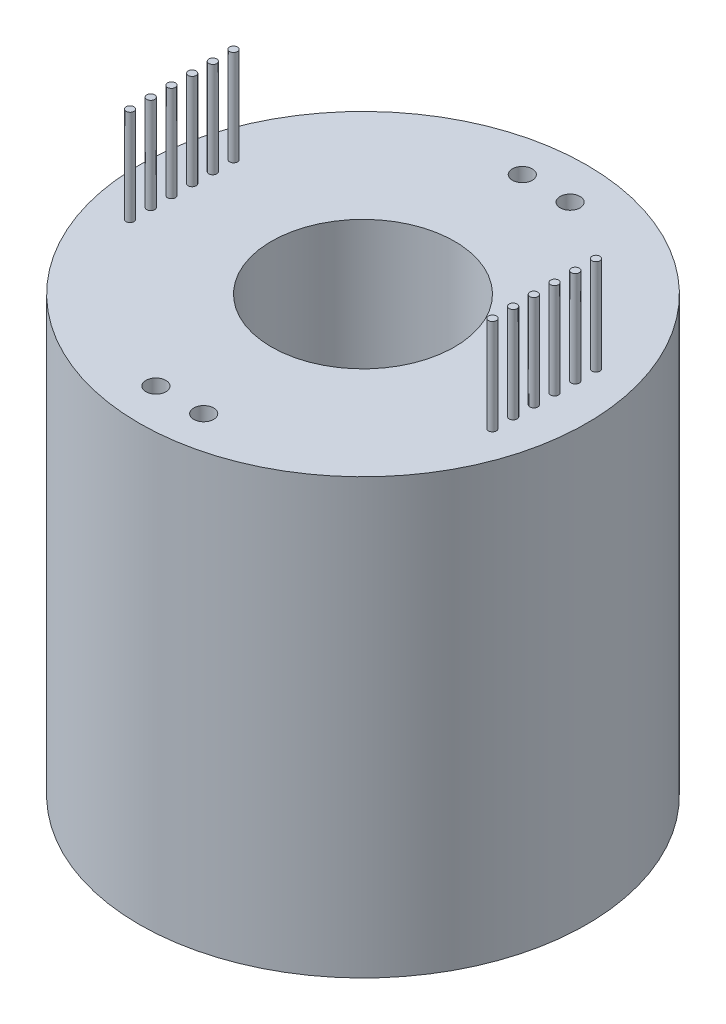
ISO-10303-21;
HEADER;
FILE_DESCRIPTION(('STEP AP214'),'2;1');
FILE_NAME('part.step','',(''),(''),'','','');
FILE_SCHEMA(('AUTOMOTIVE_DESIGN { 1 0 10303 214 1 1 1 1 }'));
ENDSEC;
DATA;
#1=APPLICATION_CONTEXT('core data for automotive mechanical design processes');
#2=APPLICATION_PROTOCOL_DEFINITION('international standard','automotive_design',2000,#1);
#3=PRODUCT_CONTEXT('',#1,'mechanical');
#4=PRODUCT('Part','Part','',(#3));
#5=PRODUCT_RELATED_PRODUCT_CATEGORY('part','',(#4));
#6=PRODUCT_DEFINITION_FORMATION('','',#4);
#7=PRODUCT_DEFINITION_CONTEXT('part definition',#1,'design');
#8=PRODUCT_DEFINITION('design','',#6,#7);
#9=PRODUCT_DEFINITION_SHAPE('','',#8);
#10=(LENGTH_UNIT() NAMED_UNIT(*) SI_UNIT(.MILLI.,.METRE.));
#11=(NAMED_UNIT(*) PLANE_ANGLE_UNIT() SI_UNIT($,.RADIAN.));
#12=(NAMED_UNIT(*) SI_UNIT($,.STERADIAN.) SOLID_ANGLE_UNIT());
#13=UNCERTAINTY_MEASURE_WITH_UNIT(LENGTH_MEASURE(1.E-05),#10,'distance_accuracy_value','');
#14=(GEOMETRIC_REPRESENTATION_CONTEXT(3) GLOBAL_UNCERTAINTY_ASSIGNED_CONTEXT((#13)) GLOBAL_UNIT_ASSIGNED_CONTEXT((#10,
#11,#12)) REPRESENTATION_CONTEXT('',''));
#15=CARTESIAN_POINT('',(0.,0.,0.));
#16=DIRECTION('',(0.,0.,1.));
#17=DIRECTION('',(1.,0.,0.));
#18=AXIS2_PLACEMENT_3D('',#15,#16,#17);
#19=CARTESIAN_POINT('',(22.75,66.5,-6.50000000000001));
#20=DIRECTION('',(0.,-1.,0.));
#21=DIRECTION('',(0.,0.,-1.));
#22=AXIS2_PLACEMENT_3D('',#19,#20,#21);
#23=CYLINDRICAL_SURFACE('',#22,0.499999999999999);
#24=CARTESIAN_POINT('',(22.75,66.5,-6.50000000000001));
#25=DIRECTION('',(0.,1.,0.));
#26=DIRECTION('',(0.,0.,-1.));
#27=AXIS2_PLACEMENT_3D('',#24,#25,#26);
#28=CIRCLE('',#27,0.499999999999999);
#29=CARTESIAN_POINT('',(22.75,66.5,-7.));
#30=VERTEX_POINT('',#29);
#31=EDGE_CURVE('E11',#30,#30,#28,.T.);
#32=ORIENTED_EDGE('',*,*,#31,.F.);
#33=EDGE_LOOP('',(#32));
#34=FACE_BOUND('',#33,.T.);
#35=CARTESIAN_POINT('',(22.75,54.5,-6.50000000000001));
#36=DIRECTION('',(0.,1.,0.));
#37=DIRECTION('',(0.,0.,-1.));
#38=AXIS2_PLACEMENT_3D('',#35,#36,#37);
#39=CIRCLE('',#38,0.499999999999999);
#40=CARTESIAN_POINT('',(22.75,54.5,-7.));
#41=VERTEX_POINT('',#40);
#42=EDGE_CURVE('E53',#41,#41,#39,.T.);
#43=ORIENTED_EDGE('',*,*,#42,.T.);
#44=EDGE_LOOP('',(#43));
#45=FACE_BOUND('',#44,.T.);
#46=ADVANCED_FACE('F50',(#34,#45),#23,.T.);
#47=CARTESIAN_POINT('',(22.75,66.5,-6.50000000000001));
#48=DIRECTION('',(0.,-1.,0.));
#49=DIRECTION('',(0.,0.,-1.));
#50=AXIS2_PLACEMENT_3D('',#47,#48,#49);
#51=PLANE('',#50);
#52=ORIENTED_EDGE('',*,*,#31,.T.);
#53=EDGE_LOOP('',(#52));
#54=FACE_BOUND('',#53,.T.);
#55=ADVANCED_FACE('F65',(#54),#51,.F.);
#56=CARTESIAN_POINT('',(22.75,54.5,-6.50000000000001));
#57=DIRECTION('',(0.,-1.,0.));
#58=DIRECTION('',(0.,0.,-1.));
#59=AXIS2_PLACEMENT_3D('',#56,#57,#58);
#60=PLANE('',#59);
#61=ORIENTED_EDGE('',*,*,#42,.F.);
#62=EDGE_LOOP('',(#61));
#63=FACE_BOUND('',#62,.T.);
#64=ADVANCED_FACE('F63',(#63),#60,.T.);
#65=CLOSED_SHELL('',(#46,#55,#64));
#66=MANIFOLD_SOLID_BREP('B2',#65);
#67=CARTESIAN_POINT('',(22.75,66.5,-3.9));
#68=DIRECTION('',(0.,-1.,0.));
#69=DIRECTION('',(0.,0.,-1.));
#70=AXIS2_PLACEMENT_3D('',#67,#68,#69);
#71=CYLINDRICAL_SURFACE('',#70,0.499999999999999);
#72=CARTESIAN_POINT('',(22.75,66.5,-3.9));
#73=DIRECTION('',(0.,1.,0.));
#74=DIRECTION('',(0.,0.,-1.));
#75=AXIS2_PLACEMENT_3D('',#72,#73,#74);
#76=CIRCLE('',#75,0.499999999999999);
#77=CARTESIAN_POINT('',(22.75,66.5,-4.4));
#78=VERTEX_POINT('',#77);
#79=EDGE_CURVE('E49',#78,#78,#76,.T.);
#80=ORIENTED_EDGE('',*,*,#79,.F.);
#81=EDGE_LOOP('',(#80));
#82=FACE_BOUND('',#81,.T.);
#83=CARTESIAN_POINT('',(22.75,54.5,-3.9));
#84=DIRECTION('',(0.,1.,0.));
#85=DIRECTION('',(0.,0.,-1.));
#86=AXIS2_PLACEMENT_3D('',#83,#84,#85);
#87=CIRCLE('',#86,0.499999999999999);
#88=CARTESIAN_POINT('',(22.75,54.5,-4.4));
#89=VERTEX_POINT('',#88);
#90=EDGE_CURVE('E102',#89,#89,#87,.T.);
#91=ORIENTED_EDGE('',*,*,#90,.T.);
#92=EDGE_LOOP('',(#91));
#93=FACE_BOUND('',#92,.T.);
#94=ADVANCED_FACE('F99',(#82,#93),#71,.T.);
#95=CARTESIAN_POINT('',(22.75,66.5,-3.9));
#96=DIRECTION('',(0.,-1.,0.));
#97=DIRECTION('',(0.,0.,-1.));
#98=AXIS2_PLACEMENT_3D('',#95,#96,#97);
#99=PLANE('',#98);
#100=ORIENTED_EDGE('',*,*,#79,.T.);
#101=EDGE_LOOP('',(#100));
#102=FACE_BOUND('',#101,.T.);
#103=ADVANCED_FACE('F114',(#102),#99,.F.);
#104=CARTESIAN_POINT('',(22.75,54.5,-3.9));
#105=DIRECTION('',(0.,-1.,0.));
#106=DIRECTION('',(0.,0.,-1.));
#107=AXIS2_PLACEMENT_3D('',#104,#105,#106);
#108=PLANE('',#107);
#109=ORIENTED_EDGE('',*,*,#90,.F.);
#110=EDGE_LOOP('',(#109));
#111=FACE_BOUND('',#110,.T.);
#112=ADVANCED_FACE('F112',(#111),#108,.T.);
#113=CLOSED_SHELL('',(#94,#103,#112));
#114=MANIFOLD_SOLID_BREP('B6',#113);
#115=CARTESIAN_POINT('',(22.75,66.5,-1.30000000000001));
#116=DIRECTION('',(0.,-1.,0.));
#117=DIRECTION('',(0.,0.,-1.));
#118=AXIS2_PLACEMENT_3D('',#115,#116,#117);
#119=CYLINDRICAL_SURFACE('',#118,0.499999999999999);
#120=CARTESIAN_POINT('',(22.75,66.5,-1.30000000000001));
#121=DIRECTION('',(0.,1.,0.));
#122=DIRECTION('',(0.,0.,-1.));
#123=AXIS2_PLACEMENT_3D('',#120,#121,#122);
#124=CIRCLE('',#123,0.499999999999999);
#125=CARTESIAN_POINT('',(22.75,66.5,-1.80000000000001));
#126=VERTEX_POINT('',#125);
#127=EDGE_CURVE('E98',#126,#126,#124,.T.);
#128=ORIENTED_EDGE('',*,*,#127,.F.);
#129=EDGE_LOOP('',(#128));
#130=FACE_BOUND('',#129,.T.);
#131=CARTESIAN_POINT('',(22.75,54.5,-1.30000000000001));
#132=DIRECTION('',(0.,1.,0.));
#133=DIRECTION('',(0.,0.,-1.));
#134=AXIS2_PLACEMENT_3D('',#131,#132,#133);
#135=CIRCLE('',#134,0.499999999999999);
#136=CARTESIAN_POINT('',(22.75,54.5,-1.80000000000001));
#137=VERTEX_POINT('',#136);
#138=EDGE_CURVE('E151',#137,#137,#135,.T.);
#139=ORIENTED_EDGE('',*,*,#138,.T.);
#140=EDGE_LOOP('',(#139));
#141=FACE_BOUND('',#140,.T.);
#142=ADVANCED_FACE('F148',(#130,#141),#119,.T.);
#143=CARTESIAN_POINT('',(22.75,66.5,-1.30000000000001));
#144=DIRECTION('',(0.,-1.,0.));
#145=DIRECTION('',(0.,0.,-1.));
#146=AXIS2_PLACEMENT_3D('',#143,#144,#145);
#147=PLANE('',#146);
#148=ORIENTED_EDGE('',*,*,#127,.T.);
#149=EDGE_LOOP('',(#148));
#150=FACE_BOUND('',#149,.T.);
#151=ADVANCED_FACE('F163',(#150),#147,.F.);
#152=CARTESIAN_POINT('',(22.75,54.5,-1.30000000000001));
#153=DIRECTION('',(0.,-1.,0.));
#154=DIRECTION('',(0.,0.,-1.));
#155=AXIS2_PLACEMENT_3D('',#152,#153,#154);
#156=PLANE('',#155);
#157=ORIENTED_EDGE('',*,*,#138,.F.);
#158=EDGE_LOOP('',(#157));
#159=FACE_BOUND('',#158,.T.);
#160=ADVANCED_FACE('F161',(#159),#156,.T.);
#161=CLOSED_SHELL('',(#142,#151,#160));
#162=MANIFOLD_SOLID_BREP('B44',#161);
#163=CARTESIAN_POINT('',(22.75,66.5,1.29999999999999));
#164=DIRECTION('',(0.,-1.,0.));
#165=DIRECTION('',(0.,0.,-1.));
#166=AXIS2_PLACEMENT_3D('',#163,#164,#165);
#167=CYLINDRICAL_SURFACE('',#166,0.499999999999999);
#168=CARTESIAN_POINT('',(22.75,66.5,1.29999999999999));
#169=DIRECTION('',(0.,1.,0.));
#170=DIRECTION('',(0.,0.,-1.));
#171=AXIS2_PLACEMENT_3D('',#168,#169,#170);
#172=CIRCLE('',#171,0.499999999999999);
#173=CARTESIAN_POINT('',(22.75,66.5,0.799999999999995));
#174=VERTEX_POINT('',#173);
#175=EDGE_CURVE('E147',#174,#174,#172,.T.);
#176=ORIENTED_EDGE('',*,*,#175,.F.);
#177=EDGE_LOOP('',(#176));
#178=FACE_BOUND('',#177,.T.);
#179=CARTESIAN_POINT('',(22.75,54.5,1.29999999999999));
#180=DIRECTION('',(0.,1.,0.));
#181=DIRECTION('',(0.,0.,-1.));
#182=AXIS2_PLACEMENT_3D('',#179,#180,#181);
#183=CIRCLE('',#182,0.499999999999999);
#184=CARTESIAN_POINT('',(22.75,54.5,0.799999999999995));
#185=VERTEX_POINT('',#184);
#186=EDGE_CURVE('E200',#185,#185,#183,.T.);
#187=ORIENTED_EDGE('',*,*,#186,.T.);
#188=EDGE_LOOP('',(#187));
#189=FACE_BOUND('',#188,.T.);
#190=ADVANCED_FACE('F197',(#178,#189),#167,.T.);
#191=CARTESIAN_POINT('',(22.75,66.5,1.29999999999999));
#192=DIRECTION('',(0.,-1.,0.));
#193=DIRECTION('',(0.,0.,-1.));
#194=AXIS2_PLACEMENT_3D('',#191,#192,#193);
#195=PLANE('',#194);
#196=ORIENTED_EDGE('',*,*,#175,.T.);
#197=EDGE_LOOP('',(#196));
#198=FACE_BOUND('',#197,.T.);
#199=ADVANCED_FACE('F212',(#198),#195,.F.);
#200=CARTESIAN_POINT('',(22.75,54.5,1.29999999999999));
#201=DIRECTION('',(0.,-1.,0.));
#202=DIRECTION('',(0.,0.,-1.));
#203=AXIS2_PLACEMENT_3D('',#200,#201,#202);
#204=PLANE('',#203);
#205=ORIENTED_EDGE('',*,*,#186,.F.);
#206=EDGE_LOOP('',(#205));
#207=FACE_BOUND('',#206,.T.);
#208=ADVANCED_FACE('F210',(#207),#204,.T.);
#209=CLOSED_SHELL('',(#190,#199,#208));
#210=MANIFOLD_SOLID_BREP('B93',#209);
#211=CARTESIAN_POINT('',(22.75,66.5,3.89999999999999));
#212=DIRECTION('',(0.,-1.,0.));
#213=DIRECTION('',(0.,0.,-1.));
#214=AXIS2_PLACEMENT_3D('',#211,#212,#213);
#215=CYLINDRICAL_SURFACE('',#214,0.499999999999999);
#216=CARTESIAN_POINT('',(22.75,66.5,3.89999999999999));
#217=DIRECTION('',(0.,1.,0.));
#218=DIRECTION('',(0.,0.,-1.));
#219=AXIS2_PLACEMENT_3D('',#216,#217,#218);
#220=CIRCLE('',#219,0.499999999999999);
#221=CARTESIAN_POINT('',(22.75,66.5,3.39999999999999));
#222=VERTEX_POINT('',#221);
#223=EDGE_CURVE('E196',#222,#222,#220,.T.);
#224=ORIENTED_EDGE('',*,*,#223,.F.);
#225=EDGE_LOOP('',(#224));
#226=FACE_BOUND('',#225,.T.);
#227=CARTESIAN_POINT('',(22.75,54.5,3.89999999999999));
#228=DIRECTION('',(0.,1.,0.));
#229=DIRECTION('',(0.,0.,-1.));
#230=AXIS2_PLACEMENT_3D('',#227,#228,#229);
#231=CIRCLE('',#230,0.499999999999999);
#232=CARTESIAN_POINT('',(22.75,54.5,3.39999999999999));
#233=VERTEX_POINT('',#232);
#234=EDGE_CURVE('E249',#233,#233,#231,.T.);
#235=ORIENTED_EDGE('',*,*,#234,.T.);
#236=EDGE_LOOP('',(#235));
#237=FACE_BOUND('',#236,.T.);
#238=ADVANCED_FACE('F246',(#226,#237),#215,.T.);
#239=CARTESIAN_POINT('',(22.75,66.5,3.89999999999999));
#240=DIRECTION('',(0.,-1.,0.));
#241=DIRECTION('',(0.,0.,-1.));
#242=AXIS2_PLACEMENT_3D('',#239,#240,#241);
#243=PLANE('',#242);
#244=ORIENTED_EDGE('',*,*,#223,.T.);
#245=EDGE_LOOP('',(#244));
#246=FACE_BOUND('',#245,.T.);
#247=ADVANCED_FACE('F261',(#246),#243,.F.);
#248=CARTESIAN_POINT('',(22.75,54.5,3.89999999999999));
#249=DIRECTION('',(0.,-1.,0.));
#250=DIRECTION('',(0.,0.,-1.));
#251=AXIS2_PLACEMENT_3D('',#248,#249,#250);
#252=PLANE('',#251);
#253=ORIENTED_EDGE('',*,*,#234,.F.);
#254=EDGE_LOOP('',(#253));
#255=FACE_BOUND('',#254,.T.);
#256=ADVANCED_FACE('F259',(#255),#252,.T.);
#257=CLOSED_SHELL('',(#238,#247,#256));
#258=MANIFOLD_SOLID_BREP('B142',#257);
#259=CARTESIAN_POINT('',(22.75,66.5,6.49999999999999));
#260=DIRECTION('',(0.,-1.,0.));
#261=DIRECTION('',(0.,0.,-1.));
#262=AXIS2_PLACEMENT_3D('',#259,#260,#261);
#263=CYLINDRICAL_SURFACE('',#262,0.499999999999999);
#264=CARTESIAN_POINT('',(22.75,66.5,6.49999999999999));
#265=DIRECTION('',(0.,1.,0.));
#266=DIRECTION('',(0.,0.,-1.));
#267=AXIS2_PLACEMENT_3D('',#264,#265,#266);
#268=CIRCLE('',#267,0.499999999999999);
#269=CARTESIAN_POINT('',(22.75,66.5,5.99999999999999));
#270=VERTEX_POINT('',#269);
#271=EDGE_CURVE('E245',#270,#270,#268,.T.);
#272=ORIENTED_EDGE('',*,*,#271,.F.);
#273=EDGE_LOOP('',(#272));
#274=FACE_BOUND('',#273,.T.);
#275=CARTESIAN_POINT('',(22.75,54.5,6.49999999999999));
#276=DIRECTION('',(0.,1.,0.));
#277=DIRECTION('',(0.,0.,-1.));
#278=AXIS2_PLACEMENT_3D('',#275,#276,#277);
#279=CIRCLE('',#278,0.499999999999999);
#280=CARTESIAN_POINT('',(22.75,54.5,5.99999999999999));
#281=VERTEX_POINT('',#280);
#282=EDGE_CURVE('E298',#281,#281,#279,.T.);
#283=ORIENTED_EDGE('',*,*,#282,.T.);
#284=EDGE_LOOP('',(#283));
#285=FACE_BOUND('',#284,.T.);
#286=ADVANCED_FACE('F295',(#274,#285),#263,.T.);
#287=CARTESIAN_POINT('',(22.75,66.5,6.49999999999999));
#288=DIRECTION('',(0.,-1.,0.));
#289=DIRECTION('',(0.,0.,-1.));
#290=AXIS2_PLACEMENT_3D('',#287,#288,#289);
#291=PLANE('',#290);
#292=ORIENTED_EDGE('',*,*,#271,.T.);
#293=EDGE_LOOP('',(#292));
#294=FACE_BOUND('',#293,.T.);
#295=ADVANCED_FACE('F310',(#294),#291,.F.);
#296=CARTESIAN_POINT('',(22.75,54.5,6.49999999999999));
#297=DIRECTION('',(0.,-1.,0.));
#298=DIRECTION('',(0.,0.,-1.));
#299=AXIS2_PLACEMENT_3D('',#296,#297,#298);
#300=PLANE('',#299);
#301=ORIENTED_EDGE('',*,*,#282,.F.);
#302=EDGE_LOOP('',(#301));
#303=FACE_BOUND('',#302,.T.);
#304=ADVANCED_FACE('F308',(#303),#300,.T.);
#305=CLOSED_SHELL('',(#286,#295,#304));
#306=MANIFOLD_SOLID_BREP('B191',#305);
#307=CARTESIAN_POINT('',(-22.75,66.5,6.5));
#308=DIRECTION('',(0.,-1.,0.));
#309=DIRECTION('',(0.,0.,-1.));
#310=AXIS2_PLACEMENT_3D('',#307,#308,#309);
#311=CYLINDRICAL_SURFACE('',#310,0.499999999999999);
#312=CARTESIAN_POINT('',(-22.75,66.5,6.5));
#313=DIRECTION('',(0.,1.,0.));
#314=DIRECTION('',(0.,0.,1.));
#315=AXIS2_PLACEMENT_3D('',#312,#313,#314);
#316=CIRCLE('',#315,0.499999999999999);
#317=CARTESIAN_POINT('',(-22.75,66.5,7.));
#318=VERTEX_POINT('',#317);
#319=EDGE_CURVE('E294',#318,#318,#316,.T.);
#320=ORIENTED_EDGE('',*,*,#319,.F.);
#321=EDGE_LOOP('',(#320));
#322=FACE_BOUND('',#321,.T.);
#323=CARTESIAN_POINT('',(-22.75,54.5,6.5));
#324=DIRECTION('',(0.,1.,0.));
#325=DIRECTION('',(0.,0.,1.));
#326=AXIS2_PLACEMENT_3D('',#323,#324,#325);
#327=CIRCLE('',#326,0.499999999999999);
#328=CARTESIAN_POINT('',(-22.75,54.5,7.));
#329=VERTEX_POINT('',#328);
#330=EDGE_CURVE('E347',#329,#329,#327,.T.);
#331=ORIENTED_EDGE('',*,*,#330,.T.);
#332=EDGE_LOOP('',(#331));
#333=FACE_BOUND('',#332,.T.);
#334=ADVANCED_FACE('F344',(#322,#333),#311,.T.);
#335=CARTESIAN_POINT('',(-22.75,66.5,6.5));
#336=DIRECTION('',(0.,1.,0.));
#337=DIRECTION('',(0.,0.,1.));
#338=AXIS2_PLACEMENT_3D('',#335,#336,#337);
#339=PLANE('',#338);
#340=ORIENTED_EDGE('',*,*,#319,.T.);
#341=EDGE_LOOP('',(#340));
#342=FACE_BOUND('',#341,.T.);
#343=ADVANCED_FACE('F359',(#342),#339,.T.);
#344=CARTESIAN_POINT('',(-22.75,54.5,6.5));
#345=DIRECTION('',(0.,1.,0.));
#346=DIRECTION('',(0.,0.,1.));
#347=AXIS2_PLACEMENT_3D('',#344,#345,#346);
#348=PLANE('',#347);
#349=ORIENTED_EDGE('',*,*,#330,.F.);
#350=EDGE_LOOP('',(#349));
#351=FACE_BOUND('',#350,.T.);
#352=ADVANCED_FACE('F357',(#351),#348,.F.);
#353=CLOSED_SHELL('',(#334,#343,#352));
#354=MANIFOLD_SOLID_BREP('B240',#353);
#355=CARTESIAN_POINT('',(-22.75,66.5,3.9));
#356=DIRECTION('',(0.,-1.,0.));
#357=DIRECTION('',(0.,0.,-1.));
#358=AXIS2_PLACEMENT_3D('',#355,#356,#357);
#359=CYLINDRICAL_SURFACE('',#358,0.499999999999999);
#360=CARTESIAN_POINT('',(-22.75,66.5,3.9));
#361=DIRECTION('',(0.,1.,0.));
#362=DIRECTION('',(0.,0.,1.));
#363=AXIS2_PLACEMENT_3D('',#360,#361,#362);
#364=CIRCLE('',#363,0.499999999999999);
#365=CARTESIAN_POINT('',(-22.75,66.5,4.4));
#366=VERTEX_POINT('',#365);
#367=EDGE_CURVE('E343',#366,#366,#364,.T.);
#368=ORIENTED_EDGE('',*,*,#367,.F.);
#369=EDGE_LOOP('',(#368));
#370=FACE_BOUND('',#369,.T.);
#371=CARTESIAN_POINT('',(-22.75,54.5,3.9));
#372=DIRECTION('',(0.,1.,0.));
#373=DIRECTION('',(0.,0.,1.));
#374=AXIS2_PLACEMENT_3D('',#371,#372,#373);
#375=CIRCLE('',#374,0.499999999999999);
#376=CARTESIAN_POINT('',(-22.75,54.5,4.4));
#377=VERTEX_POINT('',#376);
#378=EDGE_CURVE('E396',#377,#377,#375,.T.);
#379=ORIENTED_EDGE('',*,*,#378,.T.);
#380=EDGE_LOOP('',(#379));
#381=FACE_BOUND('',#380,.T.);
#382=ADVANCED_FACE('F393',(#370,#381),#359,.T.);
#383=CARTESIAN_POINT('',(-22.75,66.5,3.9));
#384=DIRECTION('',(0.,1.,0.));
#385=DIRECTION('',(0.,0.,1.));
#386=AXIS2_PLACEMENT_3D('',#383,#384,#385);
#387=PLANE('',#386);
#388=ORIENTED_EDGE('',*,*,#367,.T.);
#389=EDGE_LOOP('',(#388));
#390=FACE_BOUND('',#389,.T.);
#391=ADVANCED_FACE('F408',(#390),#387,.T.);
#392=CARTESIAN_POINT('',(-22.75,54.5,3.9));
#393=DIRECTION('',(0.,1.,0.));
#394=DIRECTION('',(0.,0.,1.));
#395=AXIS2_PLACEMENT_3D('',#392,#393,#394);
#396=PLANE('',#395);
#397=ORIENTED_EDGE('',*,*,#378,.F.);
#398=EDGE_LOOP('',(#397));
#399=FACE_BOUND('',#398,.T.);
#400=ADVANCED_FACE('F406',(#399),#396,.F.);
#401=CLOSED_SHELL('',(#382,#391,#400));
#402=MANIFOLD_SOLID_BREP('B289',#401);
#403=CARTESIAN_POINT('',(-22.75,66.5,1.3));
#404=DIRECTION('',(0.,-1.,0.));
#405=DIRECTION('',(0.,0.,-1.));
#406=AXIS2_PLACEMENT_3D('',#403,#404,#405);
#407=CYLINDRICAL_SURFACE('',#406,0.499999999999999);
#408=CARTESIAN_POINT('',(-22.75,66.5,1.3));
#409=DIRECTION('',(0.,1.,0.));
#410=DIRECTION('',(0.,0.,1.));
#411=AXIS2_PLACEMENT_3D('',#408,#409,#410);
#412=CIRCLE('',#411,0.499999999999999);
#413=CARTESIAN_POINT('',(-22.75,66.5,1.8));
#414=VERTEX_POINT('',#413);
#415=EDGE_CURVE('E392',#414,#414,#412,.T.);
#416=ORIENTED_EDGE('',*,*,#415,.F.);
#417=EDGE_LOOP('',(#416));
#418=FACE_BOUND('',#417,.T.);
#419=CARTESIAN_POINT('',(-22.75,54.5,1.3));
#420=DIRECTION('',(0.,1.,0.));
#421=DIRECTION('',(0.,0.,1.));
#422=AXIS2_PLACEMENT_3D('',#419,#420,#421);
#423=CIRCLE('',#422,0.499999999999999);
#424=CARTESIAN_POINT('',(-22.75,54.5,1.8));
#425=VERTEX_POINT('',#424);
#426=EDGE_CURVE('E445',#425,#425,#423,.T.);
#427=ORIENTED_EDGE('',*,*,#426,.T.);
#428=EDGE_LOOP('',(#427));
#429=FACE_BOUND('',#428,.T.);
#430=ADVANCED_FACE('F442',(#418,#429),#407,.T.);
#431=CARTESIAN_POINT('',(-22.75,66.5,1.3));
#432=DIRECTION('',(0.,1.,0.));
#433=DIRECTION('',(0.,0.,1.));
#434=AXIS2_PLACEMENT_3D('',#431,#432,#433);
#435=PLANE('',#434);
#436=ORIENTED_EDGE('',*,*,#415,.T.);
#437=EDGE_LOOP('',(#436));
#438=FACE_BOUND('',#437,.T.);
#439=ADVANCED_FACE('F457',(#438),#435,.T.);
#440=CARTESIAN_POINT('',(-22.75,54.5,1.3));
#441=DIRECTION('',(0.,1.,0.));
#442=DIRECTION('',(0.,0.,1.));
#443=AXIS2_PLACEMENT_3D('',#440,#441,#442);
#444=PLANE('',#443);
#445=ORIENTED_EDGE('',*,*,#426,.F.);
#446=EDGE_LOOP('',(#445));
#447=FACE_BOUND('',#446,.T.);
#448=ADVANCED_FACE('F455',(#447),#444,.F.);
#449=CLOSED_SHELL('',(#430,#439,#448));
#450=MANIFOLD_SOLID_BREP('B338',#449);
#451=CARTESIAN_POINT('',(-22.75,66.5,-1.3));
#452=DIRECTION('',(0.,-1.,0.));
#453=DIRECTION('',(0.,0.,-1.));
#454=AXIS2_PLACEMENT_3D('',#451,#452,#453);
#455=CYLINDRICAL_SURFACE('',#454,0.499999999999999);
#456=CARTESIAN_POINT('',(-22.75,66.5,-1.3));
#457=DIRECTION('',(0.,1.,0.));
#458=DIRECTION('',(0.,0.,1.));
#459=AXIS2_PLACEMENT_3D('',#456,#457,#458);
#460=CIRCLE('',#459,0.499999999999999);
#461=CARTESIAN_POINT('',(-22.75,66.5,-0.800000000000002));
#462=VERTEX_POINT('',#461);
#463=EDGE_CURVE('E441',#462,#462,#460,.T.);
#464=ORIENTED_EDGE('',*,*,#463,.F.);
#465=EDGE_LOOP('',(#464));
#466=FACE_BOUND('',#465,.T.);
#467=CARTESIAN_POINT('',(-22.75,54.5,-1.3));
#468=DIRECTION('',(0.,1.,0.));
#469=DIRECTION('',(0.,0.,1.));
#470=AXIS2_PLACEMENT_3D('',#467,#468,#469);
#471=CIRCLE('',#470,0.499999999999999);
#472=CARTESIAN_POINT('',(-22.75,54.5,-0.800000000000002));
#473=VERTEX_POINT('',#472);
#474=EDGE_CURVE('E494',#473,#473,#471,.T.);
#475=ORIENTED_EDGE('',*,*,#474,.T.);
#476=EDGE_LOOP('',(#475));
#477=FACE_BOUND('',#476,.T.);
#478=ADVANCED_FACE('F491',(#466,#477),#455,.T.);
#479=CARTESIAN_POINT('',(-22.75,66.5,-1.3));
#480=DIRECTION('',(0.,1.,0.));
#481=DIRECTION('',(0.,0.,1.));
#482=AXIS2_PLACEMENT_3D('',#479,#480,#481);
#483=PLANE('',#482);
#484=ORIENTED_EDGE('',*,*,#463,.T.);
#485=EDGE_LOOP('',(#484));
#486=FACE_BOUND('',#485,.T.);
#487=ADVANCED_FACE('F506',(#486),#483,.T.);
#488=CARTESIAN_POINT('',(-22.75,54.5,-1.3));
#489=DIRECTION('',(0.,1.,0.));
#490=DIRECTION('',(0.,0.,1.));
#491=AXIS2_PLACEMENT_3D('',#488,#489,#490);
#492=PLANE('',#491);
#493=ORIENTED_EDGE('',*,*,#474,.F.);
#494=EDGE_LOOP('',(#493));
#495=FACE_BOUND('',#494,.T.);
#496=ADVANCED_FACE('F504',(#495),#492,.F.);
#497=CLOSED_SHELL('',(#478,#487,#496));
#498=MANIFOLD_SOLID_BREP('B387',#497);
#499=CARTESIAN_POINT('',(-22.75,66.5,-3.9));
#500=DIRECTION('',(0.,-1.,0.));
#501=DIRECTION('',(0.,0.,-1.));
#502=AXIS2_PLACEMENT_3D('',#499,#500,#501);
#503=CYLINDRICAL_SURFACE('',#502,0.499999999999999);
#504=CARTESIAN_POINT('',(-22.75,66.5,-3.9));
#505=DIRECTION('',(0.,1.,0.));
#506=DIRECTION('',(0.,0.,1.));
#507=AXIS2_PLACEMENT_3D('',#504,#505,#506);
#508=CIRCLE('',#507,0.499999999999999);
#509=CARTESIAN_POINT('',(-22.75,66.5,-3.4));
#510=VERTEX_POINT('',#509);
#511=EDGE_CURVE('E490',#510,#510,#508,.T.);
#512=ORIENTED_EDGE('',*,*,#511,.F.);
#513=EDGE_LOOP('',(#512));
#514=FACE_BOUND('',#513,.T.);
#515=CARTESIAN_POINT('',(-22.75,54.5,-3.9));
#516=DIRECTION('',(0.,1.,0.));
#517=DIRECTION('',(0.,0.,1.));
#518=AXIS2_PLACEMENT_3D('',#515,#516,#517);
#519=CIRCLE('',#518,0.499999999999999);
#520=CARTESIAN_POINT('',(-22.75,54.5,-3.4));
#521=VERTEX_POINT('',#520);
#522=EDGE_CURVE('E543',#521,#521,#519,.T.);
#523=ORIENTED_EDGE('',*,*,#522,.T.);
#524=EDGE_LOOP('',(#523));
#525=FACE_BOUND('',#524,.T.);
#526=ADVANCED_FACE('F540',(#514,#525),#503,.T.);
#527=CARTESIAN_POINT('',(-22.75,66.5,-3.9));
#528=DIRECTION('',(0.,1.,0.));
#529=DIRECTION('',(0.,0.,1.));
#530=AXIS2_PLACEMENT_3D('',#527,#528,#529);
#531=PLANE('',#530);
#532=ORIENTED_EDGE('',*,*,#511,.T.);
#533=EDGE_LOOP('',(#532));
#534=FACE_BOUND('',#533,.T.);
#535=ADVANCED_FACE('F555',(#534),#531,.T.);
#536=CARTESIAN_POINT('',(-22.75,54.5,-3.9));
#537=DIRECTION('',(0.,1.,0.));
#538=DIRECTION('',(0.,0.,1.));
#539=AXIS2_PLACEMENT_3D('',#536,#537,#538);
#540=PLANE('',#539);
#541=ORIENTED_EDGE('',*,*,#522,.F.);
#542=EDGE_LOOP('',(#541));
#543=FACE_BOUND('',#542,.T.);
#544=ADVANCED_FACE('F553',(#543),#540,.F.);
#545=CLOSED_SHELL('',(#526,#535,#544));
#546=MANIFOLD_SOLID_BREP('B436',#545);
#547=CARTESIAN_POINT('',(-22.75,66.5,-6.5));
#548=DIRECTION('',(0.,-1.,0.));
#549=DIRECTION('',(0.,0.,-1.));
#550=AXIS2_PLACEMENT_3D('',#547,#548,#549);
#551=CYLINDRICAL_SURFACE('',#550,0.499999999999999);
#552=CARTESIAN_POINT('',(-22.75,66.5,-6.5));
#553=DIRECTION('',(0.,1.,0.));
#554=DIRECTION('',(0.,0.,1.));
#555=AXIS2_PLACEMENT_3D('',#552,#553,#554);
#556=CIRCLE('',#555,0.499999999999999);
#557=CARTESIAN_POINT('',(-22.75,66.5,-6.));
#558=VERTEX_POINT('',#557);
#559=EDGE_CURVE('E539',#558,#558,#556,.T.);
#560=ORIENTED_EDGE('',*,*,#559,.F.);
#561=EDGE_LOOP('',(#560));
#562=FACE_BOUND('',#561,.T.);
#563=CARTESIAN_POINT('',(-22.75,54.5,-6.5));
#564=DIRECTION('',(0.,1.,0.));
#565=DIRECTION('',(0.,0.,1.));
#566=AXIS2_PLACEMENT_3D('',#563,#564,#565);
#567=CIRCLE('',#566,0.499999999999999);
#568=CARTESIAN_POINT('',(-22.75,54.5,-6.));
#569=VERTEX_POINT('',#568);
#570=EDGE_CURVE('E593',#569,#569,#567,.T.);
#571=ORIENTED_EDGE('',*,*,#570,.T.);
#572=EDGE_LOOP('',(#571));
#573=FACE_BOUND('',#572,.T.);
#574=ADVANCED_FACE('F590',(#562,#573),#551,.T.);
#575=CARTESIAN_POINT('',(-22.75,66.5,-6.5));
#576=DIRECTION('',(0.,1.,0.));
#577=DIRECTION('',(0.,0.,1.));
#578=AXIS2_PLACEMENT_3D('',#575,#576,#577);
#579=PLANE('',#578);
#580=ORIENTED_EDGE('',*,*,#559,.T.);
#581=EDGE_LOOP('',(#580));
#582=FACE_BOUND('',#581,.T.);
#583=ADVANCED_FACE('F605',(#582),#579,.T.);
#584=CARTESIAN_POINT('',(-22.75,54.5,-6.5));
#585=DIRECTION('',(0.,1.,0.));
#586=DIRECTION('',(0.,0.,1.));
#587=AXIS2_PLACEMENT_3D('',#584,#585,#586);
#588=PLANE('',#587);
#589=ORIENTED_EDGE('',*,*,#570,.F.);
#590=EDGE_LOOP('',(#589));
#591=FACE_BOUND('',#590,.T.);
#592=ADVANCED_FACE('F603',(#591),#588,.F.);
#593=CLOSED_SHELL('',(#574,#583,#592));
#594=MANIFOLD_SOLID_BREP('B485',#593);
#595=CARTESIAN_POINT('',(0.,54.5,0.));
#596=DIRECTION('',(0.,1.,0.));
#597=DIRECTION('',(0.,0.,1.));
#598=AXIS2_PLACEMENT_3D('',#595,#596,#597);
#599=PLANE('',#598);
#600=CARTESIAN_POINT('',(0.,54.5,0.));
#601=DIRECTION('',(0.,1.,0.));
#602=DIRECTION('',(0.,0.,1.));
#603=AXIS2_PLACEMENT_3D('',#600,#601,#602);
#604=CIRCLE('',#603,11.5);
#605=CARTESIAN_POINT('',(0.,54.5,11.5));
#606=VERTEX_POINT('',#605);
#607=EDGE_CURVE('E744',#606,#606,#604,.T.);
#608=ORIENTED_EDGE('',*,*,#607,.F.);
#609=EDGE_LOOP('',(#608));
#610=FACE_BOUND('',#609,.T.);
#611=CARTESIAN_POINT('',(0.,54.5,0.));
#612=DIRECTION('',(0.,-1.,0.));
#613=DIRECTION('',(0.,0.,-1.));
#614=AXIS2_PLACEMENT_3D('',#611,#612,#613);
#615=CIRCLE('',#614,28.09);
#616=CARTESIAN_POINT('',(0.,54.5,-28.09));
#617=VERTEX_POINT('',#616);
#618=EDGE_CURVE('E588',#617,#617,#615,.T.);
#619=ORIENTED_EDGE('',*,*,#618,.F.);
#620=EDGE_LOOP('',(#619));
#621=FACE_BOUND('',#620,.T.);
#622=CARTESIAN_POINT('',(3.,54.5,-23.));
#623=DIRECTION('',(0.,1.,0.));
#624=DIRECTION('',(0.,0.,1.));
#625=AXIS2_PLACEMENT_3D('',#622,#623,#624);
#626=CIRCLE('',#625,1.25);
#627=CARTESIAN_POINT('',(3.,54.5,-21.75));
#628=VERTEX_POINT('',#627);
#629=EDGE_CURVE('E687',#628,#628,#626,.T.);
#630=ORIENTED_EDGE('',*,*,#629,.F.);
#631=EDGE_LOOP('',(#630));
#632=FACE_BOUND('',#631,.T.);
#633=CARTESIAN_POINT('',(-3.,54.5,23.));
#634=DIRECTION('',(0.,1.,0.));
#635=DIRECTION('',(0.,0.,1.));
#636=AXIS2_PLACEMENT_3D('',#633,#634,#635);
#637=CIRCLE('',#636,1.25);
#638=CARTESIAN_POINT('',(-3.,54.5,24.25));
#639=VERTEX_POINT('',#638);
#640=EDGE_CURVE('E679',#639,#639,#637,.T.);
#641=ORIENTED_EDGE('',*,*,#640,.F.);
#642=EDGE_LOOP('',(#641));
#643=FACE_BOUND('',#642,.T.);
#644=CARTESIAN_POINT('',(3.,54.5,23.));
#645=DIRECTION('',(0.,1.,0.));
#646=DIRECTION('',(0.,0.,1.));
#647=AXIS2_PLACEMENT_3D('',#644,#645,#646);
#648=CIRCLE('',#647,1.25);
#649=CARTESIAN_POINT('',(3.,54.5,24.25));
#650=VERTEX_POINT('',#649);
#651=EDGE_CURVE('E663',#650,#650,#648,.T.);
#652=ORIENTED_EDGE('',*,*,#651,.F.);
#653=EDGE_LOOP('',(#652));
#654=FACE_BOUND('',#653,.T.);
#655=CARTESIAN_POINT('',(-3.,54.5,-23.));
#656=DIRECTION('',(0.,1.,0.));
#657=DIRECTION('',(0.,0.,1.));
#658=AXIS2_PLACEMENT_3D('',#655,#656,#657);
#659=CIRCLE('',#658,1.25);
#660=CARTESIAN_POINT('',(-3.,54.5,-21.75));
#661=VERTEX_POINT('',#660);
#662=EDGE_CURVE('E664',#661,#661,#659,.T.);
#663=ORIENTED_EDGE('',*,*,#662,.F.);
#664=EDGE_LOOP('',(#663));
#665=FACE_BOUND('',#664,.T.);
#666=ADVANCED_FACE('F631',(#610,#621,#632,#643,#654,#665),#599,.T.);
#667=CARTESIAN_POINT('',(0.,0.,0.));
#668=DIRECTION('',(0.,-1.,0.));
#669=DIRECTION('',(0.,0.,-1.));
#670=AXIS2_PLACEMENT_3D('',#667,#668,#669);
#671=CYLINDRICAL_SURFACE('',#670,28.09);
#672=ORIENTED_EDGE('',*,*,#618,.T.);
#673=EDGE_LOOP('',(#672));
#674=FACE_BOUND('',#673,.T.);
#675=CARTESIAN_POINT('',(0.,0.,0.));
#676=DIRECTION('',(0.,-1.,0.));
#677=DIRECTION('',(0.,0.,-1.));
#678=AXIS2_PLACEMENT_3D('',#675,#676,#677);
#679=CIRCLE('',#678,28.09);
#680=CARTESIAN_POINT('',(0.,0.,-28.09));
#681=VERTEX_POINT('',#680);
#682=EDGE_CURVE('E639',#681,#681,#679,.T.);
#683=ORIENTED_EDGE('',*,*,#682,.F.);
#684=EDGE_LOOP('',(#683));
#685=FACE_BOUND('',#684,.T.);
#686=ADVANCED_FACE('F700',(#674,#685),#671,.T.);
#687=CARTESIAN_POINT('',(28.09,0.,0.));
#688=DIRECTION('',(0.,-1.,0.));
#689=DIRECTION('',(0.,0.,-1.));
#690=AXIS2_PLACEMENT_3D('',#687,#688,#689);
#691=PLANE('',#690);
#692=CARTESIAN_POINT('',(0.,0.,0.));
#693=DIRECTION('',(0.,1.,0.));
#694=DIRECTION('',(0.,0.,1.));
#695=AXIS2_PLACEMENT_3D('',#692,#693,#694);
#696=CIRCLE('',#695,11.5);
#697=CARTESIAN_POINT('',(0.,0.,11.5));
#698=VERTEX_POINT('',#697);
#699=EDGE_CURVE('E672',#698,#698,#696,.T.);
#700=ORIENTED_EDGE('',*,*,#699,.T.);
#701=EDGE_LOOP('',(#700));
#702=FACE_BOUND('',#701,.T.);
#703=ORIENTED_EDGE('',*,*,#682,.T.);
#704=EDGE_LOOP('',(#703));
#705=FACE_BOUND('',#704,.T.);
#706=ADVANCED_FACE('F698',(#702,#705),#691,.T.);
#707=CARTESIAN_POINT('',(3.,49.50001,-23.));
#708=DIRECTION('',(0.,1.,0.));
#709=DIRECTION('',(0.,0.,1.));
#710=AXIS2_PLACEMENT_3D('',#707,#708,#709);
#711=CONICAL_SURFACE('',#710,1.25,1.02974425867666);
#712=CARTESIAN_POINT('',(3.,48.7489342262156,-23.));
#713=VERTEX_POINT('',#712);
#714=VERTEX_LOOP('',#713);
#715=FACE_BOUND('',#714,.T.);
#716=CARTESIAN_POINT('',(3.,49.50001,-23.));
#717=DIRECTION('',(0.,1.,0.));
#718=DIRECTION('',(0.,0.,1.));
#719=AXIS2_PLACEMENT_3D('',#716,#717,#718);
#720=CIRCLE('',#719,1.25);
#721=CARTESIAN_POINT('',(3.,49.50001,-21.75));
#722=VERTEX_POINT('',#721);
#723=EDGE_CURVE('E691',#722,#722,#720,.T.);
#724=ORIENTED_EDGE('',*,*,#723,.T.);
#725=EDGE_LOOP('',(#724));
#726=FACE_BOUND('',#725,.T.);
#727=ADVANCED_FACE('F707',(#715,#726),#711,.F.);
#728=CARTESIAN_POINT('',(3.,54.5,-23.));
#729=DIRECTION('',(0.,1.,0.));
#730=DIRECTION('',(0.,0.,1.));
#731=AXIS2_PLACEMENT_3D('',#728,#729,#730);
#732=CYLINDRICAL_SURFACE('',#731,1.25);
#733=ORIENTED_EDGE('',*,*,#723,.F.);
#734=EDGE_LOOP('',(#733));
#735=FACE_BOUND('',#734,.T.);
#736=ORIENTED_EDGE('',*,*,#629,.T.);
#737=EDGE_LOOP('',(#736));
#738=FACE_BOUND('',#737,.T.);
#739=ADVANCED_FACE('F714',(#735,#738),#732,.F.);
#740=CARTESIAN_POINT('',(-3.,49.50001,23.));
#741=DIRECTION('',(0.,1.,0.));
#742=DIRECTION('',(0.,0.,1.));
#743=AXIS2_PLACEMENT_3D('',#740,#741,#742);
#744=CONICAL_SURFACE('',#743,1.25,1.02974425867666);
#745=CARTESIAN_POINT('',(-3.,48.7489342262156,23.));
#746=VERTEX_POINT('',#745);
#747=VERTEX_LOOP('',#746);
#748=FACE_BOUND('',#747,.T.);
#749=CARTESIAN_POINT('',(-3.,49.50001,23.));
#750=DIRECTION('',(0.,1.,0.));
#751=DIRECTION('',(0.,0.,1.));
#752=AXIS2_PLACEMENT_3D('',#749,#750,#751);
#753=CIRCLE('',#752,1.25);
#754=CARTESIAN_POINT('',(-3.,49.50001,24.25));
#755=VERTEX_POINT('',#754);
#756=EDGE_CURVE('E683',#755,#755,#753,.T.);
#757=ORIENTED_EDGE('',*,*,#756,.T.);
#758=EDGE_LOOP('',(#757));
#759=FACE_BOUND('',#758,.T.);
#760=ADVANCED_FACE('F717',(#748,#759),#744,.F.);
#761=CARTESIAN_POINT('',(-3.,54.5,23.));
#762=DIRECTION('',(0.,1.,0.));
#763=DIRECTION('',(0.,0.,1.));
#764=AXIS2_PLACEMENT_3D('',#761,#762,#763);
#765=CYLINDRICAL_SURFACE('',#764,1.25);
#766=ORIENTED_EDGE('',*,*,#756,.F.);
#767=EDGE_LOOP('',(#766));
#768=FACE_BOUND('',#767,.T.);
#769=ORIENTED_EDGE('',*,*,#640,.T.);
#770=EDGE_LOOP('',(#769));
#771=FACE_BOUND('',#770,.T.);
#772=ADVANCED_FACE('F721',(#768,#771),#765,.F.);
#773=CARTESIAN_POINT('',(3.,49.50001,23.));
#774=DIRECTION('',(0.,1.,0.));
#775=DIRECTION('',(0.,0.,1.));
#776=AXIS2_PLACEMENT_3D('',#773,#774,#775);
#777=CONICAL_SURFACE('',#776,1.25,1.02974425867666);
#778=CARTESIAN_POINT('',(3.,48.7489342262156,23.));
#779=VERTEX_POINT('',#778);
#780=VERTEX_LOOP('',#779);
#781=FACE_BOUND('',#780,.T.);
#782=CARTESIAN_POINT('',(3.,49.50001,23.));
#783=DIRECTION('',(0.,1.,0.));
#784=DIRECTION('',(0.,0.,1.));
#785=AXIS2_PLACEMENT_3D('',#782,#783,#784);
#786=CIRCLE('',#785,1.25);
#787=CARTESIAN_POINT('',(3.,49.50001,24.25));
#788=VERTEX_POINT('',#787);
#789=EDGE_CURVE('E669',#788,#788,#786,.T.);
#790=ORIENTED_EDGE('',*,*,#789,.T.);
#791=EDGE_LOOP('',(#790));
#792=FACE_BOUND('',#791,.T.);
#793=ADVANCED_FACE('F724',(#781,#792),#777,.F.);
#794=CARTESIAN_POINT('',(3.,54.5,23.));
#795=DIRECTION('',(0.,1.,0.));
#796=DIRECTION('',(0.,0.,1.));
#797=AXIS2_PLACEMENT_3D('',#794,#795,#796);
#798=CYLINDRICAL_SURFACE('',#797,1.25);
#799=ORIENTED_EDGE('',*,*,#789,.F.);
#800=EDGE_LOOP('',(#799));
#801=FACE_BOUND('',#800,.T.);
#802=ORIENTED_EDGE('',*,*,#651,.T.);
#803=EDGE_LOOP('',(#802));
#804=FACE_BOUND('',#803,.T.);
#805=ADVANCED_FACE('F656',(#801,#804),#798,.F.);
#806=CARTESIAN_POINT('',(-3.,49.50001,-23.));
#807=DIRECTION('',(0.,1.,0.));
#808=DIRECTION('',(0.,0.,1.));
#809=AXIS2_PLACEMENT_3D('',#806,#807,#808);
#810=CONICAL_SURFACE('',#809,1.25,1.02974425867666);
#811=CARTESIAN_POINT('',(-3.,48.7489342262156,-23.));
#812=VERTEX_POINT('',#811);
#813=VERTEX_LOOP('',#812);
#814=FACE_BOUND('',#813,.T.);
#815=CARTESIAN_POINT('',(-3.,49.50001,-23.));
#816=DIRECTION('',(0.,1.,0.));
#817=DIRECTION('',(0.,0.,1.));
#818=AXIS2_PLACEMENT_3D('',#815,#816,#817);
#819=CIRCLE('',#818,1.25);
#820=CARTESIAN_POINT('',(-3.,49.50001,-21.75));
#821=VERTEX_POINT('',#820);
#822=EDGE_CURVE('E660',#821,#821,#819,.T.);
#823=ORIENTED_EDGE('',*,*,#822,.T.);
#824=EDGE_LOOP('',(#823));
#825=FACE_BOUND('',#824,.T.);
#826=ADVANCED_FACE('F652',(#814,#825),#810,.F.);
#827=CARTESIAN_POINT('',(-3.,54.5,-23.));
#828=DIRECTION('',(0.,1.,0.));
#829=DIRECTION('',(0.,0.,1.));
#830=AXIS2_PLACEMENT_3D('',#827,#828,#829);
#831=CYLINDRICAL_SURFACE('',#830,1.25);
#832=ORIENTED_EDGE('',*,*,#822,.F.);
#833=EDGE_LOOP('',(#832));
#834=FACE_BOUND('',#833,.T.);
#835=ORIENTED_EDGE('',*,*,#662,.T.);
#836=EDGE_LOOP('',(#835));
#837=FACE_BOUND('',#836,.T.);
#838=ADVANCED_FACE('F655',(#834,#837),#831,.F.);
#839=CARTESIAN_POINT('',(0.,0.,0.));
#840=DIRECTION('',(0.,1.,0.));
#841=DIRECTION('',(0.,0.,1.));
#842=AXIS2_PLACEMENT_3D('',#839,#840,#841);
#843=CYLINDRICAL_SURFACE('',#842,11.5);
#844=ORIENTED_EDGE('',*,*,#699,.F.);
#845=EDGE_LOOP('',(#844));
#846=FACE_BOUND('',#845,.T.);
#847=ORIENTED_EDGE('',*,*,#607,.T.);
#848=EDGE_LOOP('',(#847));
#849=FACE_BOUND('',#848,.T.);
#850=ADVANCED_FACE('F734',(#846,#849),#843,.F.);
#851=CLOSED_SHELL('',(#666,#686,#706,#727,#739,#760,#772,#793,#805,#826,#838,#850));
#852=MANIFOLD_SOLID_BREP('B534',#851);
#853=ADVANCED_BREP_SHAPE_REPRESENTATION('',(#18,#66,#114,#162,#210,#258,#306,#354,#402,#450,
#498,#546,#594,#852),#14);
#854=SHAPE_DEFINITION_REPRESENTATION(#9,#853);
ENDSEC;
END-ISO-10303-21;
